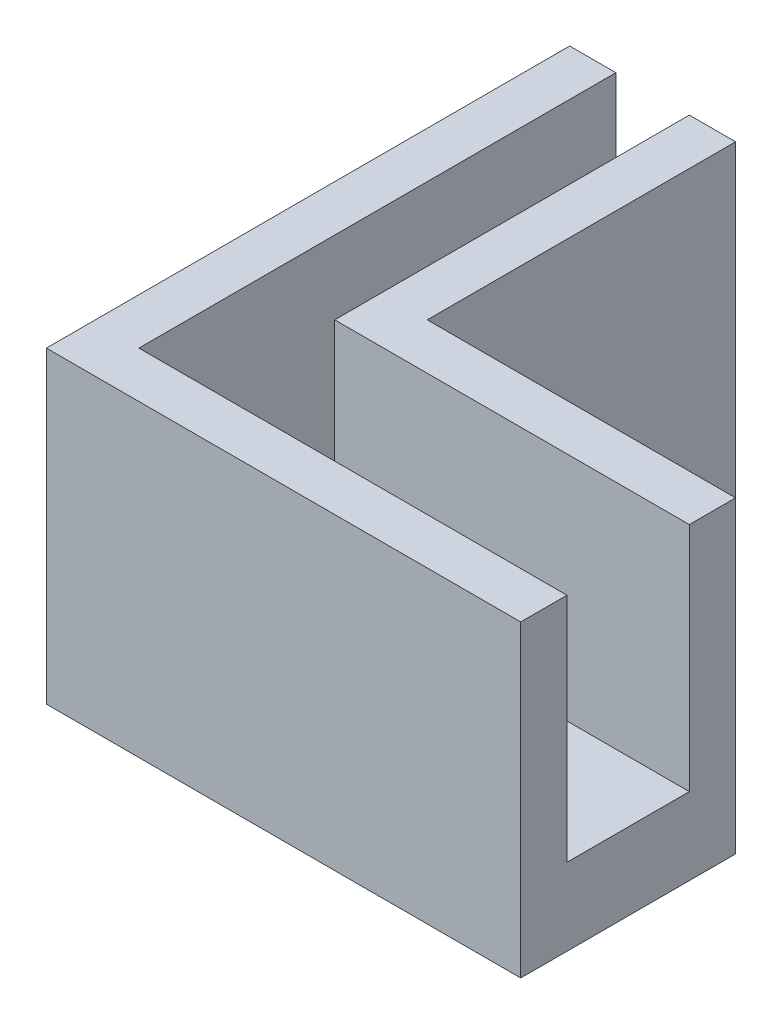
ISO-10303-21;
HEADER;
FILE_DESCRIPTION(('STEP AP214'),'2;1');
FILE_NAME('part.step','',(''),(''),'','','');
FILE_SCHEMA(('AUTOMOTIVE_DESIGN { 1 0 10303 214 1 1 1 1 }'));
ENDSEC;
DATA;
#1=APPLICATION_CONTEXT('core data for automotive mechanical design processes');
#2=APPLICATION_PROTOCOL_DEFINITION('international standard','automotive_design',2000,#1);
#3=PRODUCT_CONTEXT('',#1,'mechanical');
#4=PRODUCT('Part','Part','',(#3));
#5=PRODUCT_RELATED_PRODUCT_CATEGORY('part','',(#4));
#6=PRODUCT_DEFINITION_FORMATION('','',#4);
#7=PRODUCT_DEFINITION_CONTEXT('part definition',#1,'design');
#8=PRODUCT_DEFINITION('design','',#6,#7);
#9=PRODUCT_DEFINITION_SHAPE('','',#8);
#10=(LENGTH_UNIT() NAMED_UNIT(*) SI_UNIT(.MILLI.,.METRE.));
#11=(NAMED_UNIT(*) PLANE_ANGLE_UNIT() SI_UNIT($,.RADIAN.));
#12=(NAMED_UNIT(*) SI_UNIT($,.STERADIAN.) SOLID_ANGLE_UNIT());
#13=UNCERTAINTY_MEASURE_WITH_UNIT(LENGTH_MEASURE(1.E-05),#10,'distance_accuracy_value','');
#14=(GEOMETRIC_REPRESENTATION_CONTEXT(3) GLOBAL_UNCERTAINTY_ASSIGNED_CONTEXT((#13)) GLOBAL_UNIT_ASSIGNED_CONTEXT((#10,
#11,#12)) REPRESENTATION_CONTEXT('',''));
#15=CARTESIAN_POINT('',(0.,0.,0.));
#16=DIRECTION('',(0.,0.,1.));
#17=DIRECTION('',(1.,0.,0.));
#18=AXIS2_PLACEMENT_3D('',#15,#16,#17);
#19=CARTESIAN_POINT('',(0.,15.,0.));
#20=DIRECTION('',(0.,-1.,0.));
#21=DIRECTION('',(0.,0.,-1.));
#22=AXIS2_PLACEMENT_3D('',#19,#20,#21);
#23=PLANE('',#22);
#24=DIRECTION('',(0.,0.,1.));
#25=VECTOR('',#24,1.);
#26=CARTESIAN_POINT('',(0.,15.,-27.9375));
#27=LINE('',#26,#25);
#28=CARTESIAN_POINT('',(0.,15.,-30.9375));
#29=VERTEX_POINT('',#28);
#30=CARTESIAN_POINT('',(0.,15.,0.));
#31=VERTEX_POINT('',#30);
#32=EDGE_CURVE('E220',#29,#31,#27,.T.);
#33=ORIENTED_EDGE('',*,*,#32,.F.);
#34=DIRECTION('',(-1.,0.,0.));
#35=VECTOR('',#34,1.);
#36=CARTESIAN_POINT('',(-3.,15.,-30.9375));
#37=LINE('',#36,#35);
#38=CARTESIAN_POINT('',(-3.,15.,-30.9375));
#39=VERTEX_POINT('',#38);
#40=EDGE_CURVE('E155',#29,#39,#37,.T.);
#41=ORIENTED_EDGE('',*,*,#40,.T.);
#42=DIRECTION('',(0.,0.,1.));
#43=VECTOR('',#42,1.);
#44=CARTESIAN_POINT('',(-3.,15.,-27.9375));
#45=LINE('',#44,#43);
#46=CARTESIAN_POINT('',(-3.,15.,3.));
#47=VERTEX_POINT('',#46);
#48=EDGE_CURVE('E154',#39,#47,#45,.T.);
#49=ORIENTED_EDGE('',*,*,#48,.T.);
#50=DIRECTION('',(1.,0.,0.));
#51=VECTOR('',#50,1.);
#52=CARTESIAN_POINT('',(-3.,15.,3.));
#53=LINE('',#52,#51);
#54=CARTESIAN_POINT('',(27.7625,15.,3.));
#55=VERTEX_POINT('',#54);
#56=EDGE_CURVE('E159',#47,#55,#53,.T.);
#57=ORIENTED_EDGE('',*,*,#56,.T.);
#58=DIRECTION('',(0.,0.,-1.));
#59=VECTOR('',#58,1.);
#60=CARTESIAN_POINT('',(27.7625,15.,3.));
#61=LINE('',#60,#59);
#62=CARTESIAN_POINT('',(27.7625,15.,0.));
#63=VERTEX_POINT('',#62);
#64=EDGE_CURVE('E166',#55,#63,#61,.T.);
#65=ORIENTED_EDGE('',*,*,#64,.T.);
#66=DIRECTION('',(1.,0.,0.));
#67=VECTOR('',#66,1.);
#68=CARTESIAN_POINT('',(0.,15.,0.));
#69=LINE('',#68,#67);
#70=EDGE_CURVE('E223',#31,#63,#69,.T.);
#71=ORIENTED_EDGE('',*,*,#70,.F.);
#72=EDGE_LOOP('',(#33,#41,#49,#57,#65,#71));
#73=FACE_BOUND('',#72,.T.);
#74=ADVANCED_FACE('F39',(#73),#23,.F.);
#75=CARTESIAN_POINT('',(7.7625,15.,-30.9375));
#76=VERTEX_POINT('',#75);
#77=CARTESIAN_POINT('',(4.7625,15.,-30.9375));
#78=VERTEX_POINT('',#77);
#79=EDGE_CURVE('E142',#76,#78,#37,.T.);
#80=ORIENTED_EDGE('',*,*,#79,.T.);
#81=DIRECTION('',(0.,0.,-1.));
#82=VECTOR('',#81,1.);
#83=CARTESIAN_POINT('',(4.7625,15.,-7.9375));
#84=LINE('',#83,#82);
#85=CARTESIAN_POINT('',(4.7625,15.,-7.9375));
#86=VERTEX_POINT('',#85);
#87=EDGE_CURVE('E129',#86,#78,#84,.T.);
#88=ORIENTED_EDGE('',*,*,#87,.F.);
#89=DIRECTION('',(-1.,0.,0.));
#90=VECTOR('',#89,1.);
#91=CARTESIAN_POINT('',(24.7625,15.,-7.9375));
#92=LINE('',#91,#90);
#93=CARTESIAN_POINT('',(27.7625,15.,-7.9375));
#94=VERTEX_POINT('',#93);
#95=EDGE_CURVE('E138',#94,#86,#92,.T.);
#96=ORIENTED_EDGE('',*,*,#95,.F.);
#97=CARTESIAN_POINT('',(27.7625,15.,-10.9375));
#98=VERTEX_POINT('',#97);
#99=EDGE_CURVE('E60',#94,#98,#61,.T.);
#100=ORIENTED_EDGE('',*,*,#99,.T.);
#101=DIRECTION('',(-1.,0.,0.));
#102=VECTOR('',#101,1.);
#103=CARTESIAN_POINT('',(27.7625,15.,-10.9375));
#104=LINE('',#103,#102);
#105=CARTESIAN_POINT('',(7.7625,15.,-10.9375));
#106=VERTEX_POINT('',#105);
#107=EDGE_CURVE('E55',#98,#106,#104,.T.);
#108=ORIENTED_EDGE('',*,*,#107,.T.);
#109=DIRECTION('',(0.,0.,-1.));
#110=VECTOR('',#109,1.);
#111=CARTESIAN_POINT('',(7.7625,15.,-30.9375));
#112=LINE('',#111,#110);
#113=EDGE_CURVE('E151',#106,#76,#112,.T.);
#114=ORIENTED_EDGE('',*,*,#113,.T.);
#115=EDGE_LOOP('',(#80,#88,#96,#100,#108,#114));
#116=FACE_BOUND('',#115,.T.);
#117=ADVANCED_FACE('F150',(#116),#23,.F.);
#118=CARTESIAN_POINT('',(-3.,15.,-30.9375));
#119=DIRECTION('',(0.,0.,1.));
#120=DIRECTION('',(1.,0.,0.));
#121=AXIS2_PLACEMENT_3D('',#118,#119,#120);
#122=PLANE('',#121);
#123=ORIENTED_EDGE('',*,*,#40,.F.);
#124=DIRECTION('',(0.,1.,0.));
#125=VECTOR('',#124,1.);
#126=CARTESIAN_POINT('',(0.,-8.48551154910533,-30.9375));
#127=LINE('',#126,#125);
#128=CARTESIAN_POINT('',(0.,0.,-30.9375));
#129=VERTEX_POINT('',#128);
#130=EDGE_CURVE('E147',#129,#29,#127,.T.);
#131=ORIENTED_EDGE('',*,*,#130,.F.);
#132=DIRECTION('',(1.,0.,0.));
#133=VECTOR('',#132,1.);
#134=CARTESIAN_POINT('',(4.7625,0.,-30.9375));
#135=LINE('',#134,#133);
#136=CARTESIAN_POINT('',(4.7625,0.,-30.9375));
#137=VERTEX_POINT('',#136);
#138=EDGE_CURVE('E145',#129,#137,#135,.T.);
#139=ORIENTED_EDGE('',*,*,#138,.T.);
#140=DIRECTION('',(0.,1.,0.));
#141=VECTOR('',#140,1.);
#142=CARTESIAN_POINT('',(4.7625,-8.48551154910533,-30.9375));
#143=LINE('',#142,#141);
#144=EDGE_CURVE('E133',#137,#78,#143,.T.);
#145=ORIENTED_EDGE('',*,*,#144,.T.);
#146=ORIENTED_EDGE('',*,*,#79,.F.);
#147=DIRECTION('',(0.,-1.,0.));
#148=VECTOR('',#147,1.);
#149=CARTESIAN_POINT('',(7.7625,15.,-30.9375));
#150=LINE('',#149,#148);
#151=CARTESIAN_POINT('',(7.7625,-5.,-30.9375));
#152=VERTEX_POINT('',#151);
#153=EDGE_CURVE('E11',#76,#152,#150,.T.);
#154=ORIENTED_EDGE('',*,*,#153,.T.);
#155=DIRECTION('',(1.,0.,0.));
#156=VECTOR('',#155,1.);
#157=CARTESIAN_POINT('',(7.7625,-5.,-30.9375));
#158=LINE('',#157,#156);
#159=CARTESIAN_POINT('',(-3.,-5.,-30.9375));
#160=VERTEX_POINT('',#159);
#161=EDGE_CURVE('E198',#160,#152,#158,.T.);
#162=ORIENTED_EDGE('',*,*,#161,.F.);
#163=DIRECTION('',(0.,-1.,0.));
#164=VECTOR('',#163,1.);
#165=CARTESIAN_POINT('',(-3.,15.,-30.9375));
#166=LINE('',#165,#164);
#167=EDGE_CURVE('E48',#39,#160,#166,.T.);
#168=ORIENTED_EDGE('',*,*,#167,.F.);
#169=EDGE_LOOP('',(#123,#131,#139,#145,#146,#154,#162,#168));
#170=FACE_BOUND('',#169,.T.);
#171=ADVANCED_FACE('F41',(#170),#122,.F.);
#172=CARTESIAN_POINT('',(-3.,15.,-27.9375));
#173=DIRECTION('',(1.,0.,0.));
#174=DIRECTION('',(0.,0.,-1.));
#175=AXIS2_PLACEMENT_3D('',#172,#173,#174);
#176=PLANE('',#175);
#177=ORIENTED_EDGE('',*,*,#167,.T.);
#178=DIRECTION('',(0.,0.,-1.));
#179=VECTOR('',#178,1.);
#180=CARTESIAN_POINT('',(-3.,-5.,-30.9375));
#181=LINE('',#180,#179);
#182=CARTESIAN_POINT('',(-3.,-5.,3.));
#183=VERTEX_POINT('',#182);
#184=EDGE_CURVE('E191',#183,#160,#181,.T.);
#185=ORIENTED_EDGE('',*,*,#184,.F.);
#186=DIRECTION('',(0.,-1.,0.));
#187=VECTOR('',#186,1.);
#188=CARTESIAN_POINT('',(-3.,15.,3.));
#189=LINE('',#188,#187);
#190=EDGE_CURVE('E181',#47,#183,#189,.T.);
#191=ORIENTED_EDGE('',*,*,#190,.F.);
#192=ORIENTED_EDGE('',*,*,#48,.F.);
#193=EDGE_LOOP('',(#177,#185,#191,#192));
#194=FACE_BOUND('',#193,.T.);
#195=ADVANCED_FACE('F189',(#194),#176,.F.);
#196=CARTESIAN_POINT('',(24.7625,15.,3.));
#197=DIRECTION('',(0.,0.,-1.));
#198=DIRECTION('',(-1.,0.,0.));
#199=AXIS2_PLACEMENT_3D('',#196,#197,#198);
#200=PLANE('',#199);
#201=ORIENTED_EDGE('',*,*,#190,.T.);
#202=DIRECTION('',(-1.,0.,0.));
#203=VECTOR('',#202,1.);
#204=CARTESIAN_POINT('',(-3.,-5.,3.));
#205=LINE('',#204,#203);
#206=CARTESIAN_POINT('',(27.7625,-5.,3.));
#207=VERTEX_POINT('',#206);
#208=EDGE_CURVE('E202',#207,#183,#205,.T.);
#209=ORIENTED_EDGE('',*,*,#208,.F.);
#210=DIRECTION('',(0.,-1.,0.));
#211=VECTOR('',#210,1.);
#212=CARTESIAN_POINT('',(27.7625,15.,3.));
#213=LINE('',#212,#211);
#214=EDGE_CURVE('E178',#55,#207,#213,.T.);
#215=ORIENTED_EDGE('',*,*,#214,.F.);
#216=ORIENTED_EDGE('',*,*,#56,.F.);
#217=EDGE_LOOP('',(#201,#209,#215,#216));
#218=FACE_BOUND('',#217,.T.);
#219=ADVANCED_FACE('F288',(#218),#200,.F.);
#220=CARTESIAN_POINT('',(27.7625,15.,3.));
#221=DIRECTION('',(-1.,0.,0.));
#222=DIRECTION('',(0.,0.,1.));
#223=AXIS2_PLACEMENT_3D('',#220,#221,#222);
#224=PLANE('',#223);
#225=DIRECTION('',(0.,0.,1.));
#226=VECTOR('',#225,1.);
#227=CARTESIAN_POINT('',(27.7625,0.,-7.9375));
#228=LINE('',#227,#226);
#229=CARTESIAN_POINT('',(27.7625,0.,-7.9375));
#230=VERTEX_POINT('',#229);
#231=CARTESIAN_POINT('',(27.7625,0.,0.));
#232=VERTEX_POINT('',#231);
#233=EDGE_CURVE('E148',#230,#232,#228,.T.);
#234=ORIENTED_EDGE('',*,*,#233,.T.);
#235=DIRECTION('',(0.,1.,0.));
#236=VECTOR('',#235,1.);
#237=CARTESIAN_POINT('',(27.7625,-8.48551154910533,0.));
#238=LINE('',#237,#236);
#239=EDGE_CURVE('E265',#232,#63,#238,.T.);
#240=ORIENTED_EDGE('',*,*,#239,.T.);
#241=ORIENTED_EDGE('',*,*,#64,.F.);
#242=ORIENTED_EDGE('',*,*,#214,.T.);
#243=DIRECTION('',(0.,0.,1.));
#244=VECTOR('',#243,1.);
#245=CARTESIAN_POINT('',(27.7625,-5.,3.));
#246=LINE('',#245,#244);
#247=CARTESIAN_POINT('',(27.7625,-5.,-10.9375));
#248=VERTEX_POINT('',#247);
#249=EDGE_CURVE('E216',#248,#207,#246,.T.);
#250=ORIENTED_EDGE('',*,*,#249,.F.);
#251=DIRECTION('',(0.,-1.,0.));
#252=VECTOR('',#251,1.);
#253=CARTESIAN_POINT('',(27.7625,15.,-10.9375));
#254=LINE('',#253,#252);
#255=EDGE_CURVE('E175',#98,#248,#254,.T.);
#256=ORIENTED_EDGE('',*,*,#255,.F.);
#257=ORIENTED_EDGE('',*,*,#99,.F.);
#258=DIRECTION('',(0.,1.,0.));
#259=VECTOR('',#258,1.);
#260=CARTESIAN_POINT('',(27.7625,-8.48551154910533,-7.9375));
#261=LINE('',#260,#259);
#262=EDGE_CURVE('E261',#230,#94,#261,.T.);
#263=ORIENTED_EDGE('',*,*,#262,.F.);
#264=EDGE_LOOP('',(#234,#240,#241,#242,#250,#256,#257,#263));
#265=FACE_BOUND('',#264,.T.);
#266=ADVANCED_FACE('F274',(#265),#224,.F.);
#267=CARTESIAN_POINT('',(24.7625,15.,-10.9375));
#268=DIRECTION('',(0.,0.,1.));
#269=DIRECTION('',(1.,0.,0.));
#270=AXIS2_PLACEMENT_3D('',#267,#268,#269);
#271=PLANE('',#270);
#272=ORIENTED_EDGE('',*,*,#255,.T.);
#273=DIRECTION('',(1.,0.,0.));
#274=VECTOR('',#273,1.);
#275=CARTESIAN_POINT('',(27.7625,-5.,-10.9375));
#276=LINE('',#275,#274);
#277=CARTESIAN_POINT('',(7.7625,-5.,-10.9375));
#278=VERTEX_POINT('',#277);
#279=EDGE_CURVE('E209',#278,#248,#276,.T.);
#280=ORIENTED_EDGE('',*,*,#279,.F.);
#281=DIRECTION('',(0.,-1.,0.));
#282=VECTOR('',#281,1.);
#283=CARTESIAN_POINT('',(7.7625,15.,-10.9375));
#284=LINE('',#283,#282);
#285=EDGE_CURVE('E172',#106,#278,#284,.T.);
#286=ORIENTED_EDGE('',*,*,#285,.F.);
#287=ORIENTED_EDGE('',*,*,#107,.F.);
#288=EDGE_LOOP('',(#272,#280,#286,#287));
#289=FACE_BOUND('',#288,.T.);
#290=ADVANCED_FACE('F283',(#289),#271,.F.);
#291=CARTESIAN_POINT('',(7.7625,15.,-10.9375));
#292=DIRECTION('',(-1.,0.,0.));
#293=DIRECTION('',(0.,0.,1.));
#294=AXIS2_PLACEMENT_3D('',#291,#292,#293);
#295=PLANE('',#294);
#296=ORIENTED_EDGE('',*,*,#285,.T.);
#297=DIRECTION('',(0.,0.,1.));
#298=VECTOR('',#297,1.);
#299=CARTESIAN_POINT('',(7.7625,-5.,-10.9375));
#300=LINE('',#299,#298);
#301=EDGE_CURVE('E206',#152,#278,#300,.T.);
#302=ORIENTED_EDGE('',*,*,#301,.F.);
#303=ORIENTED_EDGE('',*,*,#153,.F.);
#304=ORIENTED_EDGE('',*,*,#113,.F.);
#305=EDGE_LOOP('',(#296,#302,#303,#304));
#306=FACE_BOUND('',#305,.T.);
#307=ADVANCED_FACE('F285',(#306),#295,.F.);
#308=CARTESIAN_POINT('',(0.,15.,-27.9375));
#309=DIRECTION('',(1.,0.,0.));
#310=DIRECTION('',(0.,0.,-1.));
#311=AXIS2_PLACEMENT_3D('',#308,#309,#310);
#312=PLANE('',#311);
#313=DIRECTION('',(0.,0.,1.));
#314=VECTOR('',#313,1.);
#315=CARTESIAN_POINT('',(0.,0.,-27.9375));
#316=LINE('',#315,#314);
#317=CARTESIAN_POINT('',(0.,0.,0.));
#318=VERTEX_POINT('',#317);
#319=EDGE_CURVE('E219',#129,#318,#316,.T.);
#320=ORIENTED_EDGE('',*,*,#319,.F.);
#321=ORIENTED_EDGE('',*,*,#130,.T.);
#322=ORIENTED_EDGE('',*,*,#32,.T.);
#323=DIRECTION('',(0.,-1.,0.));
#324=VECTOR('',#323,1.);
#325=CARTESIAN_POINT('',(0.,15.,0.));
#326=LINE('',#325,#324);
#327=EDGE_CURVE('E242',#31,#318,#326,.T.);
#328=ORIENTED_EDGE('',*,*,#327,.T.);
#329=EDGE_LOOP('',(#320,#321,#322,#328));
#330=FACE_BOUND('',#329,.T.);
#331=ADVANCED_FACE('F248',(#330),#312,.T.);
#332=CARTESIAN_POINT('',(4.7625,15.,0.));
#333=DIRECTION('',(0.,0.,-1.));
#334=DIRECTION('',(-1.,0.,0.));
#335=AXIS2_PLACEMENT_3D('',#332,#333,#334);
#336=PLANE('',#335);
#337=DIRECTION('',(1.,0.,0.));
#338=VECTOR('',#337,1.);
#339=CARTESIAN_POINT('',(4.7625,0.,0.));
#340=LINE('',#339,#338);
#341=EDGE_CURVE('E232',#318,#232,#340,.T.);
#342=ORIENTED_EDGE('',*,*,#341,.F.);
#343=ORIENTED_EDGE('',*,*,#327,.F.);
#344=ORIENTED_EDGE('',*,*,#70,.T.);
#345=ORIENTED_EDGE('',*,*,#239,.F.);
#346=EDGE_LOOP('',(#342,#343,#344,#345));
#347=FACE_BOUND('',#346,.T.);
#348=ADVANCED_FACE('F291',(#347),#336,.T.);
#349=CARTESIAN_POINT('',(24.7625,15.,-7.9375));
#350=DIRECTION('',(0.,0.,1.));
#351=DIRECTION('',(1.,0.,0.));
#352=AXIS2_PLACEMENT_3D('',#349,#350,#351);
#353=PLANE('',#352);
#354=DIRECTION('',(-1.,0.,0.));
#355=VECTOR('',#354,1.);
#356=CARTESIAN_POINT('',(24.7625,0.,-7.9375));
#357=LINE('',#356,#355);
#358=CARTESIAN_POINT('',(4.7625,0.,-7.9375));
#359=VERTEX_POINT('',#358);
#360=EDGE_CURVE('E235',#230,#359,#357,.T.);
#361=ORIENTED_EDGE('',*,*,#360,.F.);
#362=ORIENTED_EDGE('',*,*,#262,.T.);
#363=ORIENTED_EDGE('',*,*,#95,.T.);
#364=DIRECTION('',(0.,-1.,0.));
#365=VECTOR('',#364,1.);
#366=CARTESIAN_POINT('',(4.7625,15.,-7.9375));
#367=LINE('',#366,#365);
#368=EDGE_CURVE('E135',#86,#359,#367,.T.);
#369=ORIENTED_EDGE('',*,*,#368,.T.);
#370=EDGE_LOOP('',(#361,#362,#363,#369));
#371=FACE_BOUND('',#370,.T.);
#372=ADVANCED_FACE('F277',(#371),#353,.T.);
#373=CARTESIAN_POINT('',(4.7625,15.,-7.9375));
#374=DIRECTION('',(-1.,0.,0.));
#375=DIRECTION('',(0.,0.,1.));
#376=AXIS2_PLACEMENT_3D('',#373,#374,#375);
#377=PLANE('',#376);
#378=DIRECTION('',(0.,0.,-1.));
#379=VECTOR('',#378,1.);
#380=CARTESIAN_POINT('',(4.7625,0.,-7.9375));
#381=LINE('',#380,#379);
#382=EDGE_CURVE('E224',#359,#137,#381,.T.);
#383=ORIENTED_EDGE('',*,*,#382,.F.);
#384=ORIENTED_EDGE('',*,*,#368,.F.);
#385=ORIENTED_EDGE('',*,*,#87,.T.);
#386=ORIENTED_EDGE('',*,*,#144,.F.);
#387=EDGE_LOOP('',(#383,#384,#385,#386));
#388=FACE_BOUND('',#387,.T.);
#389=ADVANCED_FACE('F132',(#388),#377,.T.);
#390=CARTESIAN_POINT('',(0.,0.,0.));
#391=DIRECTION('',(0.,1.,0.));
#392=DIRECTION('',(0.,0.,1.));
#393=AXIS2_PLACEMENT_3D('',#390,#391,#392);
#394=PLANE('',#393);
#395=ORIENTED_EDGE('',*,*,#382,.T.);
#396=ORIENTED_EDGE('',*,*,#138,.F.);
#397=ORIENTED_EDGE('',*,*,#319,.T.);
#398=ORIENTED_EDGE('',*,*,#341,.T.);
#399=ORIENTED_EDGE('',*,*,#233,.F.);
#400=ORIENTED_EDGE('',*,*,#360,.T.);
#401=EDGE_LOOP('',(#395,#396,#397,#398,#399,#400));
#402=FACE_BOUND('',#401,.T.);
#403=ADVANCED_FACE('F253',(#402),#394,.T.);
#404=CARTESIAN_POINT('',(0.,-5.,0.));
#405=DIRECTION('',(0.,1.,0.));
#406=DIRECTION('',(0.,0.,1.));
#407=AXIS2_PLACEMENT_3D('',#404,#405,#406);
#408=PLANE('',#407);
#409=ORIENTED_EDGE('',*,*,#208,.T.);
#410=ORIENTED_EDGE('',*,*,#184,.T.);
#411=ORIENTED_EDGE('',*,*,#161,.T.);
#412=ORIENTED_EDGE('',*,*,#301,.T.);
#413=ORIENTED_EDGE('',*,*,#279,.T.);
#414=ORIENTED_EDGE('',*,*,#249,.T.);
#415=EDGE_LOOP('',(#409,#410,#411,#412,#413,#414));
#416=FACE_BOUND('',#415,.T.);
#417=ADVANCED_FACE('F196',(#416),#408,.F.);
#418=CLOSED_SHELL('',(#74,#117,#171,#195,#219,#266,#290,#307,#331,#348,#372,#389,#403,#417));
#419=MANIFOLD_SOLID_BREP('B2',#418);
#420=ADVANCED_BREP_SHAPE_REPRESENTATION('',(#18,#419),#14);
#421=SHAPE_DEFINITION_REPRESENTATION(#9,#420);
ENDSEC;
END-ISO-10303-21;
